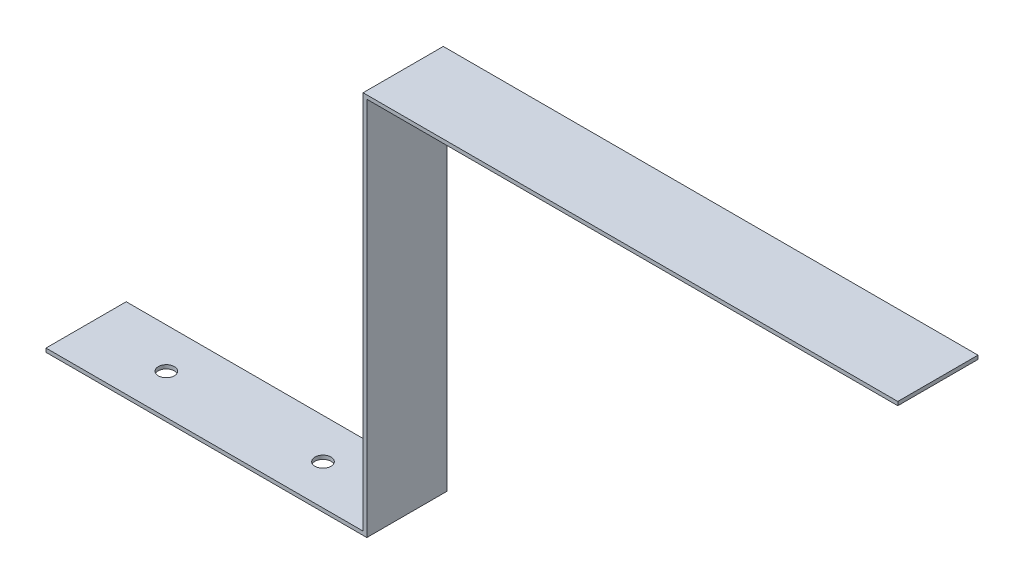
ISO-10303-21;
HEADER;
FILE_DESCRIPTION(('STEP AP214'),'2;1');
FILE_NAME('part.step','',(''),(''),'','','');
FILE_SCHEMA(('AUTOMOTIVE_DESIGN { 1 0 10303 214 1 1 1 1 }'));
ENDSEC;
DATA;
#1=APPLICATION_CONTEXT('core data for automotive mechanical design processes');
#2=APPLICATION_PROTOCOL_DEFINITION('international standard','automotive_design',2000,#1);
#3=PRODUCT_CONTEXT('',#1,'mechanical');
#4=PRODUCT('Part','Part','',(#3));
#5=PRODUCT_RELATED_PRODUCT_CATEGORY('part','',(#4));
#6=PRODUCT_DEFINITION_FORMATION('','',#4);
#7=PRODUCT_DEFINITION_CONTEXT('part definition',#1,'design');
#8=PRODUCT_DEFINITION('design','',#6,#7);
#9=PRODUCT_DEFINITION_SHAPE('','',#8);
#10=(LENGTH_UNIT() NAMED_UNIT(*) SI_UNIT(.MILLI.,.METRE.));
#11=(NAMED_UNIT(*) PLANE_ANGLE_UNIT() SI_UNIT($,.RADIAN.));
#12=(NAMED_UNIT(*) SI_UNIT($,.STERADIAN.) SOLID_ANGLE_UNIT());
#13=UNCERTAINTY_MEASURE_WITH_UNIT(LENGTH_MEASURE(1.E-05),#10,'distance_accuracy_value','');
#14=(GEOMETRIC_REPRESENTATION_CONTEXT(3) GLOBAL_UNCERTAINTY_ASSIGNED_CONTEXT((#13)) GLOBAL_UNIT_ASSIGNED_CONTEXT((#10,
#11,#12)) REPRESENTATION_CONTEXT('',''));
#15=CARTESIAN_POINT('',(0.,0.,0.));
#16=DIRECTION('',(0.,0.,1.));
#17=DIRECTION('',(1.,0.,0.));
#18=AXIS2_PLACEMENT_3D('',#15,#16,#17);
#19=CARTESIAN_POINT('',(0.,0.69999999999999,15.));
#20=DIRECTION('',(1.,0.,0.));
#21=DIRECTION('',(0.,1.,0.));
#22=AXIS2_PLACEMENT_3D('',#19,#20,#21);
#23=PLANE('',#22);
#24=DIRECTION('',(0.,-1.,0.));
#25=VECTOR('',#24,1.);
#26=CARTESIAN_POINT('',(0.,0.69999999999999,0.));
#27=LINE('',#26,#25);
#28=CARTESIAN_POINT('',(0.,0.69999999999999,0.));
#29=VERTEX_POINT('',#28);
#30=CARTESIAN_POINT('',(0.,0.,0.));
#31=VERTEX_POINT('',#30);
#32=EDGE_CURVE('E140',#29,#31,#27,.T.);
#33=ORIENTED_EDGE('',*,*,#32,.T.);
#34=DIRECTION('',(0.,0.,-1.));
#35=VECTOR('',#34,1.);
#36=CARTESIAN_POINT('',(0.,0.,15.));
#37=LINE('',#36,#35);
#38=CARTESIAN_POINT('',(0.,0.,15.));
#39=VERTEX_POINT('',#38);
#40=EDGE_CURVE('E11',#39,#31,#37,.T.);
#41=ORIENTED_EDGE('',*,*,#40,.F.);
#42=DIRECTION('',(0.,-1.,0.));
#43=VECTOR('',#42,1.);
#44=CARTESIAN_POINT('',(0.,0.69999999999999,15.));
#45=LINE('',#44,#43);
#46=CARTESIAN_POINT('',(0.,0.69999999999999,15.));
#47=VERTEX_POINT('',#46);
#48=EDGE_CURVE('E163',#47,#39,#45,.T.);
#49=ORIENTED_EDGE('',*,*,#48,.F.);
#50=DIRECTION('',(0.,0.,-1.));
#51=VECTOR('',#50,1.);
#52=CARTESIAN_POINT('',(0.,0.69999999999999,15.));
#53=LINE('',#52,#51);
#54=EDGE_CURVE('E136',#47,#29,#53,.T.);
#55=ORIENTED_EDGE('',*,*,#54,.T.);
#56=EDGE_LOOP('',(#33,#41,#49,#55));
#57=FACE_BOUND('',#56,.T.);
#58=ADVANCED_FACE('F39',(#57),#23,.F.);
#59=CARTESIAN_POINT('',(0.,0.,15.));
#60=DIRECTION('',(0.,1.,0.));
#61=DIRECTION('',(0.,0.,1.));
#62=AXIS2_PLACEMENT_3D('',#59,#60,#61);
#63=PLANE('',#62);
#64=CARTESIAN_POINT('',(15.,0.,7.5));
#65=DIRECTION('',(0.,1.,0.));
#66=DIRECTION('',(-1.,0.,0.));
#67=AXIS2_PLACEMENT_3D('',#64,#65,#66);
#68=CIRCLE('',#67,1.5);
#69=CARTESIAN_POINT('',(13.5,0.,7.5));
#70=VERTEX_POINT('',#69);
#71=EDGE_CURVE('E145',#70,#70,#68,.T.);
#72=ORIENTED_EDGE('',*,*,#71,.T.);
#73=EDGE_LOOP('',(#72));
#74=FACE_BOUND('',#73,.T.);
#75=CARTESIAN_POINT('',(44.3,0.,7.5));
#76=DIRECTION('',(0.,1.,0.));
#77=DIRECTION('',(-1.,0.,0.));
#78=AXIS2_PLACEMENT_3D('',#75,#76,#77);
#79=CIRCLE('',#78,1.5);
#80=CARTESIAN_POINT('',(42.8,0.,7.5));
#81=VERTEX_POINT('',#80);
#82=EDGE_CURVE('E211',#81,#81,#79,.T.);
#83=ORIENTED_EDGE('',*,*,#82,.T.);
#84=EDGE_LOOP('',(#83));
#85=FACE_BOUND('',#84,.T.);
#86=DIRECTION('',(1.,0.,0.));
#87=VECTOR('',#86,1.);
#88=CARTESIAN_POINT('',(0.,0.,0.));
#89=LINE('',#88,#87);
#90=CARTESIAN_POINT('',(60.,0.,0.));
#91=VERTEX_POINT('',#90);
#92=EDGE_CURVE('E144',#31,#91,#89,.T.);
#93=ORIENTED_EDGE('',*,*,#92,.T.);
#94=DIRECTION('',(0.,0.,-1.));
#95=VECTOR('',#94,1.);
#96=CARTESIAN_POINT('',(60.,0.,15.));
#97=LINE('',#96,#95);
#98=CARTESIAN_POINT('',(60.,0.,15.));
#99=VERTEX_POINT('',#98);
#100=EDGE_CURVE('E48',#99,#91,#97,.T.);
#101=ORIENTED_EDGE('',*,*,#100,.F.);
#102=DIRECTION('',(1.,0.,0.));
#103=VECTOR('',#102,1.);
#104=CARTESIAN_POINT('',(0.,0.,15.));
#105=LINE('',#104,#103);
#106=EDGE_CURVE('E99',#39,#99,#105,.T.);
#107=ORIENTED_EDGE('',*,*,#106,.F.);
#108=ORIENTED_EDGE('',*,*,#40,.T.);
#109=EDGE_LOOP('',(#93,#101,#107,#108));
#110=FACE_BOUND('',#109,.T.);
#111=ADVANCED_FACE('F223',(#74,#85,#110),#63,.F.);
#112=CARTESIAN_POINT('',(60.,0.,15.));
#113=DIRECTION('',(-1.,0.,0.));
#114=DIRECTION('',(0.,0.,1.));
#115=AXIS2_PLACEMENT_3D('',#112,#113,#114);
#116=PLANE('',#115);
#117=DIRECTION('',(0.,1.,0.));
#118=VECTOR('',#117,1.);
#119=CARTESIAN_POINT('',(60.,0.,0.));
#120=LINE('',#119,#118);
#121=CARTESIAN_POINT('',(60.,71.,0.));
#122=VERTEX_POINT('',#121);
#123=EDGE_CURVE('E148',#91,#122,#120,.T.);
#124=ORIENTED_EDGE('',*,*,#123,.T.);
#125=DIRECTION('',(0.,0.,-1.));
#126=VECTOR('',#125,1.);
#127=CARTESIAN_POINT('',(60.,71.,15.));
#128=LINE('',#127,#126);
#129=CARTESIAN_POINT('',(60.,71.,15.));
#130=VERTEX_POINT('',#129);
#131=EDGE_CURVE('E174',#130,#122,#128,.T.);
#132=ORIENTED_EDGE('',*,*,#131,.F.);
#133=DIRECTION('',(0.,1.,0.));
#134=VECTOR('',#133,1.);
#135=CARTESIAN_POINT('',(60.,0.,15.));
#136=LINE('',#135,#134);
#137=EDGE_CURVE('E184',#99,#130,#136,.T.);
#138=ORIENTED_EDGE('',*,*,#137,.F.);
#139=ORIENTED_EDGE('',*,*,#100,.T.);
#140=EDGE_LOOP('',(#124,#132,#138,#139));
#141=FACE_BOUND('',#140,.T.);
#142=ADVANCED_FACE('F182',(#141),#116,.F.);
#143=CARTESIAN_POINT('',(60.,71.,15.));
#144=DIRECTION('',(0.,1.,0.));
#145=DIRECTION('',(0.,0.,1.));
#146=AXIS2_PLACEMENT_3D('',#143,#144,#145);
#147=PLANE('',#146);
#148=DIRECTION('',(1.,0.,0.));
#149=VECTOR('',#148,1.);
#150=CARTESIAN_POINT('',(60.,71.,0.));
#151=LINE('',#150,#149);
#152=CARTESIAN_POINT('',(159.3,71.,0.));
#153=VERTEX_POINT('',#152);
#154=EDGE_CURVE('E151',#122,#153,#151,.T.);
#155=ORIENTED_EDGE('',*,*,#154,.T.);
#156=DIRECTION('',(0.,0.,-1.));
#157=VECTOR('',#156,1.);
#158=CARTESIAN_POINT('',(159.3,71.,15.));
#159=LINE('',#158,#157);
#160=CARTESIAN_POINT('',(159.3,71.,15.));
#161=VERTEX_POINT('',#160);
#162=EDGE_CURVE('E170',#161,#153,#159,.T.);
#163=ORIENTED_EDGE('',*,*,#162,.F.);
#164=DIRECTION('',(1.,0.,0.));
#165=VECTOR('',#164,1.);
#166=CARTESIAN_POINT('',(60.,71.,15.));
#167=LINE('',#166,#165);
#168=EDGE_CURVE('E197',#130,#161,#167,.T.);
#169=ORIENTED_EDGE('',*,*,#168,.F.);
#170=ORIENTED_EDGE('',*,*,#131,.T.);
#171=EDGE_LOOP('',(#155,#163,#169,#170));
#172=FACE_BOUND('',#171,.T.);
#173=ADVANCED_FACE('F192',(#172),#147,.F.);
#174=CARTESIAN_POINT('',(159.3,71.,15.));
#175=DIRECTION('',(-1.,0.,0.));
#176=DIRECTION('',(0.,0.,1.));
#177=AXIS2_PLACEMENT_3D('',#174,#175,#176);
#178=PLANE('',#177);
#179=DIRECTION('',(0.,1.,0.));
#180=VECTOR('',#179,1.);
#181=CARTESIAN_POINT('',(159.3,71.,0.));
#182=LINE('',#181,#180);
#183=CARTESIAN_POINT('',(159.3,71.7,0.));
#184=VERTEX_POINT('',#183);
#185=EDGE_CURVE('E154',#153,#184,#182,.T.);
#186=ORIENTED_EDGE('',*,*,#185,.T.);
#187=DIRECTION('',(0.,0.,-1.));
#188=VECTOR('',#187,1.);
#189=CARTESIAN_POINT('',(159.3,71.7,15.));
#190=LINE('',#189,#188);
#191=CARTESIAN_POINT('',(159.3,71.7,15.));
#192=VERTEX_POINT('',#191);
#193=EDGE_CURVE('E129',#192,#184,#190,.T.);
#194=ORIENTED_EDGE('',*,*,#193,.F.);
#195=DIRECTION('',(0.,1.,0.));
#196=VECTOR('',#195,1.);
#197=CARTESIAN_POINT('',(159.3,71.,15.));
#198=LINE('',#197,#196);
#199=EDGE_CURVE('E118',#161,#192,#198,.T.);
#200=ORIENTED_EDGE('',*,*,#199,.F.);
#201=ORIENTED_EDGE('',*,*,#162,.T.);
#202=EDGE_LOOP('',(#186,#194,#200,#201));
#203=FACE_BOUND('',#202,.T.);
#204=ADVANCED_FACE('F195',(#203),#178,.F.);
#205=CARTESIAN_POINT('',(159.3,71.7,15.));
#206=DIRECTION('',(0.,-1.,0.));
#207=DIRECTION('',(1.,0.,0.));
#208=AXIS2_PLACEMENT_3D('',#205,#206,#207);
#209=PLANE('',#208);
#210=DIRECTION('',(-1.,0.,0.));
#211=VECTOR('',#210,1.);
#212=CARTESIAN_POINT('',(159.3,71.7,0.));
#213=LINE('',#212,#211);
#214=CARTESIAN_POINT('',(59.3,71.7,0.));
#215=VERTEX_POINT('',#214);
#216=EDGE_CURVE('E127',#184,#215,#213,.T.);
#217=ORIENTED_EDGE('',*,*,#216,.T.);
#218=DIRECTION('',(0.,0.,-1.));
#219=VECTOR('',#218,1.);
#220=CARTESIAN_POINT('',(59.3,71.7,15.));
#221=LINE('',#220,#219);
#222=CARTESIAN_POINT('',(59.3,71.7,15.));
#223=VERTEX_POINT('',#222);
#224=EDGE_CURVE('E124',#223,#215,#221,.T.);
#225=ORIENTED_EDGE('',*,*,#224,.F.);
#226=DIRECTION('',(-1.,0.,0.));
#227=VECTOR('',#226,1.);
#228=CARTESIAN_POINT('',(159.3,71.7,15.));
#229=LINE('',#228,#227);
#230=EDGE_CURVE('E112',#192,#223,#229,.T.);
#231=ORIENTED_EDGE('',*,*,#230,.F.);
#232=ORIENTED_EDGE('',*,*,#193,.T.);
#233=EDGE_LOOP('',(#217,#225,#231,#232));
#234=FACE_BOUND('',#233,.T.);
#235=ADVANCED_FACE('F125',(#234),#209,.F.);
#236=CARTESIAN_POINT('',(59.3,71.7,15.));
#237=DIRECTION('',(1.,0.,0.));
#238=DIRECTION('',(0.,1.,0.));
#239=AXIS2_PLACEMENT_3D('',#236,#237,#238);
#240=PLANE('',#239);
#241=DIRECTION('',(0.,-1.,0.));
#242=VECTOR('',#241,1.);
#243=CARTESIAN_POINT('',(59.3,71.7,0.));
#244=LINE('',#243,#242);
#245=CARTESIAN_POINT('',(59.3,0.700000000000006,0.));
#246=VERTEX_POINT('',#245);
#247=EDGE_CURVE('E85',#215,#246,#244,.T.);
#248=ORIENTED_EDGE('',*,*,#247,.T.);
#249=DIRECTION('',(0.,0.,-1.));
#250=VECTOR('',#249,1.);
#251=CARTESIAN_POINT('',(59.3,0.700000000000006,15.));
#252=LINE('',#251,#250);
#253=CARTESIAN_POINT('',(59.3,0.700000000000006,15.));
#254=VERTEX_POINT('',#253);
#255=EDGE_CURVE('E130',#254,#246,#252,.T.);
#256=ORIENTED_EDGE('',*,*,#255,.F.);
#257=DIRECTION('',(0.,-1.,0.));
#258=VECTOR('',#257,1.);
#259=CARTESIAN_POINT('',(59.3,71.7,15.));
#260=LINE('',#259,#258);
#261=EDGE_CURVE('E116',#223,#254,#260,.T.);
#262=ORIENTED_EDGE('',*,*,#261,.F.);
#263=ORIENTED_EDGE('',*,*,#224,.T.);
#264=EDGE_LOOP('',(#248,#256,#262,#263));
#265=FACE_BOUND('',#264,.T.);
#266=ADVANCED_FACE('F132',(#265),#240,.F.);
#267=CARTESIAN_POINT('',(59.3,0.700000000000006,15.));
#268=DIRECTION('',(0.,-1.,0.));
#269=DIRECTION('',(1.,0.,0.));
#270=AXIS2_PLACEMENT_3D('',#267,#268,#269);
#271=PLANE('',#270);
#272=CARTESIAN_POINT('',(15.,0.699999999999994,7.5));
#273=DIRECTION('',(0.,1.,0.));
#274=DIRECTION('',(-1.,0.,0.));
#275=AXIS2_PLACEMENT_3D('',#272,#273,#274);
#276=CIRCLE('',#275,1.5);
#277=CARTESIAN_POINT('',(13.5,0.699999999999993,7.5));
#278=VERTEX_POINT('',#277);
#279=EDGE_CURVE('E215',#278,#278,#276,.T.);
#280=ORIENTED_EDGE('',*,*,#279,.F.);
#281=EDGE_LOOP('',(#280));
#282=FACE_BOUND('',#281,.T.);
#283=CARTESIAN_POINT('',(44.3,0.700000000000002,7.5));
#284=DIRECTION('',(0.,1.,0.));
#285=DIRECTION('',(-1.,0.,0.));
#286=AXIS2_PLACEMENT_3D('',#283,#284,#285);
#287=CIRCLE('',#286,1.5);
#288=CARTESIAN_POINT('',(42.8,0.700000000000002,7.5));
#289=VERTEX_POINT('',#288);
#290=EDGE_CURVE('E207',#289,#289,#287,.T.);
#291=ORIENTED_EDGE('',*,*,#290,.F.);
#292=EDGE_LOOP('',(#291));
#293=FACE_BOUND('',#292,.T.);
#294=DIRECTION('',(-1.,0.,0.));
#295=VECTOR('',#294,1.);
#296=CARTESIAN_POINT('',(59.3,0.700000000000006,0.));
#297=LINE('',#296,#295);
#298=EDGE_CURVE('E91',#246,#29,#297,.T.);
#299=ORIENTED_EDGE('',*,*,#298,.T.);
#300=ORIENTED_EDGE('',*,*,#54,.F.);
#301=DIRECTION('',(-1.,0.,0.));
#302=VECTOR('',#301,1.);
#303=CARTESIAN_POINT('',(59.3,0.700000000000006,15.));
#304=LINE('',#303,#302);
#305=EDGE_CURVE('E56',#254,#47,#304,.T.);
#306=ORIENTED_EDGE('',*,*,#305,.F.);
#307=ORIENTED_EDGE('',*,*,#255,.T.);
#308=EDGE_LOOP('',(#299,#300,#306,#307));
#309=FACE_BOUND('',#308,.T.);
#310=ADVANCED_FACE('F233',(#282,#293,#309),#271,.F.);
#311=CARTESIAN_POINT('',(0.,0.,15.));
#312=DIRECTION('',(0.,0.,1.));
#313=DIRECTION('',(1.,0.,0.));
#314=AXIS2_PLACEMENT_3D('',#311,#312,#313);
#315=PLANE('',#314);
#316=ORIENTED_EDGE('',*,*,#48,.T.);
#317=ORIENTED_EDGE('',*,*,#106,.T.);
#318=ORIENTED_EDGE('',*,*,#137,.T.);
#319=ORIENTED_EDGE('',*,*,#168,.T.);
#320=ORIENTED_EDGE('',*,*,#199,.T.);
#321=ORIENTED_EDGE('',*,*,#230,.T.);
#322=ORIENTED_EDGE('',*,*,#261,.T.);
#323=ORIENTED_EDGE('',*,*,#305,.T.);
#324=EDGE_LOOP('',(#316,#317,#318,#319,#320,#321,#322,#323));
#325=FACE_BOUND('',#324,.T.);
#326=ADVANCED_FACE('F114',(#325),#315,.T.);
#327=CARTESIAN_POINT('',(0.,0.,0.));
#328=DIRECTION('',(0.,0.,1.));
#329=DIRECTION('',(1.,0.,0.));
#330=AXIS2_PLACEMENT_3D('',#327,#328,#329);
#331=PLANE('',#330);
#332=ORIENTED_EDGE('',*,*,#32,.F.);
#333=ORIENTED_EDGE('',*,*,#298,.F.);
#334=ORIENTED_EDGE('',*,*,#247,.F.);
#335=ORIENTED_EDGE('',*,*,#216,.F.);
#336=ORIENTED_EDGE('',*,*,#185,.F.);
#337=ORIENTED_EDGE('',*,*,#154,.F.);
#338=ORIENTED_EDGE('',*,*,#123,.F.);
#339=ORIENTED_EDGE('',*,*,#92,.F.);
#340=EDGE_LOOP('',(#332,#333,#334,#335,#336,#337,#338,#339));
#341=FACE_BOUND('',#340,.T.);
#342=ADVANCED_FACE('F188',(#341),#331,.F.);
#343=CARTESIAN_POINT('',(44.3,0.,7.5));
#344=DIRECTION('',(0.,1.,0.));
#345=DIRECTION('',(-1.,0.,0.));
#346=AXIS2_PLACEMENT_3D('',#343,#344,#345);
#347=CYLINDRICAL_SURFACE('',#346,1.5);
#348=ORIENTED_EDGE('',*,*,#82,.F.);
#349=EDGE_LOOP('',(#348));
#350=FACE_BOUND('',#349,.T.);
#351=ORIENTED_EDGE('',*,*,#290,.T.);
#352=EDGE_LOOP('',(#351));
#353=FACE_BOUND('',#352,.T.);
#354=ADVANCED_FACE('F229',(#350,#353),#347,.F.);
#355=CARTESIAN_POINT('',(15.,0.,7.5));
#356=DIRECTION('',(0.,1.,0.));
#357=DIRECTION('',(-1.,0.,0.));
#358=AXIS2_PLACEMENT_3D('',#355,#356,#357);
#359=CYLINDRICAL_SURFACE('',#358,1.5);
#360=ORIENTED_EDGE('',*,*,#71,.F.);
#361=EDGE_LOOP('',(#360));
#362=FACE_BOUND('',#361,.T.);
#363=ORIENTED_EDGE('',*,*,#279,.T.);
#364=EDGE_LOOP('',(#363));
#365=FACE_BOUND('',#364,.T.);
#366=ADVANCED_FACE('F226',(#362,#365),#359,.F.);
#367=CLOSED_SHELL('',(#58,#111,#142,#173,#204,#235,#266,#310,#326,#342,#354,#366));
#368=MANIFOLD_SOLID_BREP('B2',#367);
#369=ADVANCED_BREP_SHAPE_REPRESENTATION('',(#18,#368),#14);
#370=SHAPE_DEFINITION_REPRESENTATION(#9,#369);
ENDSEC;
END-ISO-10303-21;
